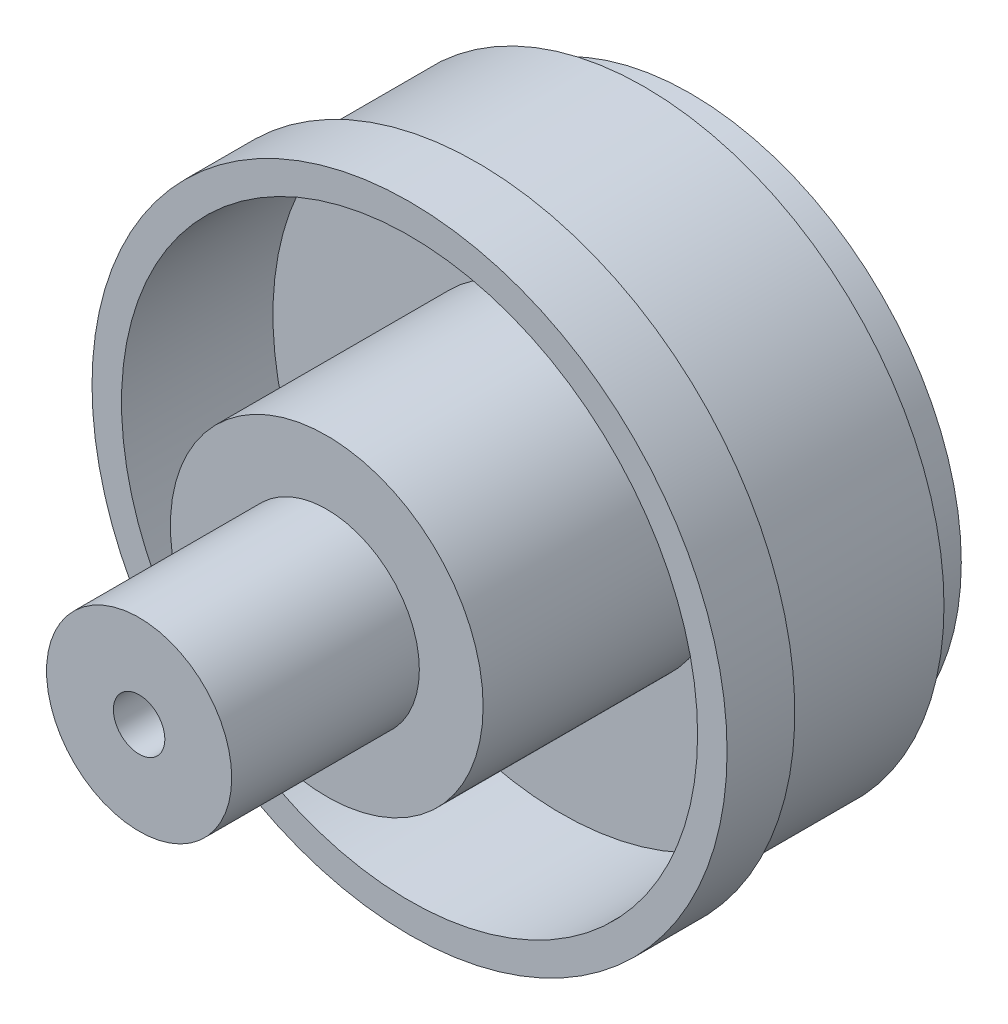
ISO-10303-21;
HEADER;
FILE_DESCRIPTION(('STEP AP214'),'2;1');
FILE_NAME('part.step','',(''),(''),'','','');
FILE_SCHEMA(('AUTOMOTIVE_DESIGN { 1 0 10303 214 1 1 1 1 }'));
ENDSEC;
DATA;
#1=APPLICATION_CONTEXT('core data for automotive mechanical design processes');
#2=APPLICATION_PROTOCOL_DEFINITION('international standard','automotive_design',2000,#1);
#3=PRODUCT_CONTEXT('',#1,'mechanical');
#4=PRODUCT('Part','Part','',(#3));
#5=PRODUCT_RELATED_PRODUCT_CATEGORY('part','',(#4));
#6=PRODUCT_DEFINITION_FORMATION('','',#4);
#7=PRODUCT_DEFINITION_CONTEXT('part definition',#1,'design');
#8=PRODUCT_DEFINITION('design','',#6,#7);
#9=PRODUCT_DEFINITION_SHAPE('','',#8);
#10=(LENGTH_UNIT() NAMED_UNIT(*) SI_UNIT(.MILLI.,.METRE.));
#11=(NAMED_UNIT(*) PLANE_ANGLE_UNIT() SI_UNIT($,.RADIAN.));
#12=(NAMED_UNIT(*) SI_UNIT($,.STERADIAN.) SOLID_ANGLE_UNIT());
#13=UNCERTAINTY_MEASURE_WITH_UNIT(LENGTH_MEASURE(1.E-05),#10,'distance_accuracy_value','');
#14=(GEOMETRIC_REPRESENTATION_CONTEXT(3) GLOBAL_UNCERTAINTY_ASSIGNED_CONTEXT((#13)) GLOBAL_UNIT_ASSIGNED_CONTEXT((#10,
#11,#12)) REPRESENTATION_CONTEXT('',''));
#15=CARTESIAN_POINT('',(0.,0.,0.));
#16=DIRECTION('',(0.,0.,1.));
#17=DIRECTION('',(1.,0.,0.));
#18=AXIS2_PLACEMENT_3D('',#15,#16,#17);
#19=CARTESIAN_POINT('',(0.,0.,32.9057));
#20=DIRECTION('',(0.,0.,-1.));
#21=DIRECTION('',(-1.,0.,0.));
#22=AXIS2_PLACEMENT_3D('',#19,#20,#21);
#23=CYLINDRICAL_SURFACE('',#22,46.228);
#24=CARTESIAN_POINT('',(0.,0.,32.9057));
#25=DIRECTION('',(0.,0.,-1.));
#26=DIRECTION('',(-1.,0.,0.));
#27=AXIS2_PLACEMENT_3D('',#24,#25,#26);
#28=CIRCLE('',#27,46.228);
#29=CARTESIAN_POINT('',(-46.228,0.,32.9057));
#30=VERTEX_POINT('',#29);
#31=EDGE_CURVE('E63',#30,#30,#28,.T.);
#32=ORIENTED_EDGE('',*,*,#31,.T.);
#33=EDGE_LOOP('',(#32));
#34=FACE_BOUND('',#33,.T.);
#35=CARTESIAN_POINT('',(0.,0.,7.112));
#36=DIRECTION('',(0.,0.,-1.));
#37=DIRECTION('',(-1.,0.,0.));
#38=AXIS2_PLACEMENT_3D('',#35,#36,#37);
#39=CIRCLE('',#38,46.228);
#40=CARTESIAN_POINT('',(-46.228,0.,7.112));
#41=VERTEX_POINT('',#40);
#42=EDGE_CURVE('E43',#41,#41,#39,.F.);
#43=ORIENTED_EDGE('',*,*,#42,.T.);
#44=EDGE_LOOP('',(#43));
#45=FACE_BOUND('',#44,.T.);
#46=ADVANCED_FACE('F39',(#34,#45),#23,.T.);
#47=CARTESIAN_POINT('',(0.,0.,56.134));
#48=DIRECTION('',(0.,0.,1.));
#49=DIRECTION('',(1.,0.,0.));
#50=AXIS2_PLACEMENT_3D('',#47,#48,#49);
#51=PLANE('',#50);
#52=CARTESIAN_POINT('',(0.,0.,56.134));
#53=DIRECTION('',(0.,0.,1.));
#54=DIRECTION('',(1.,0.,0.));
#55=AXIS2_PLACEMENT_3D('',#52,#53,#54);
#56=CIRCLE('',#55,14.2875);
#57=CARTESIAN_POINT('',(14.2875,0.,56.134));
#58=VERTEX_POINT('',#57);
#59=EDGE_CURVE('E52',#58,#58,#56,.T.);
#60=ORIENTED_EDGE('',*,*,#59,.F.);
#61=EDGE_LOOP('',(#60));
#62=FACE_BOUND('',#61,.T.);
#63=CARTESIAN_POINT('',(0.,0.,56.134));
#64=DIRECTION('',(0.,0.,1.));
#65=DIRECTION('',(1.,0.,0.));
#66=AXIS2_PLACEMENT_3D('',#63,#64,#65);
#67=CIRCLE('',#66,24.13);
#68=CARTESIAN_POINT('',(24.13,0.,56.134));
#69=VERTEX_POINT('',#68);
#70=EDGE_CURVE('E60',#69,#69,#67,.T.);
#71=ORIENTED_EDGE('',*,*,#70,.T.);
#72=EDGE_LOOP('',(#71));
#73=FACE_BOUND('',#72,.T.);
#74=ADVANCED_FACE('F102',(#62,#73),#51,.T.);
#75=CARTESIAN_POINT('',(0.,0.,85.09));
#76=DIRECTION('',(0.,0.,1.));
#77=DIRECTION('',(1.,0.,0.));
#78=AXIS2_PLACEMENT_3D('',#75,#76,#77);
#79=PLANE('',#78);
#80=CARTESIAN_POINT('',(0.,0.,85.09));
#81=DIRECTION('',(0.,0.,1.));
#82=DIRECTION('',(1.,0.,0.));
#83=AXIS2_PLACEMENT_3D('',#80,#81,#82);
#84=CIRCLE('',#83,3.96875);
#85=CARTESIAN_POINT('',(3.96875,0.,85.09));
#86=VERTEX_POINT('',#85);
#87=EDGE_CURVE('E47',#86,#86,#84,.T.);
#88=ORIENTED_EDGE('',*,*,#87,.F.);
#89=EDGE_LOOP('',(#88));
#90=FACE_BOUND('',#89,.T.);
#91=CARTESIAN_POINT('',(0.,0.,85.09));
#92=DIRECTION('',(0.,0.,1.));
#93=DIRECTION('',(1.,0.,0.));
#94=AXIS2_PLACEMENT_3D('',#91,#92,#93);
#95=CIRCLE('',#94,14.2875);
#96=CARTESIAN_POINT('',(14.2875,0.,85.09));
#97=VERTEX_POINT('',#96);
#98=EDGE_CURVE('E55',#97,#97,#95,.T.);
#99=ORIENTED_EDGE('',*,*,#98,.T.);
#100=EDGE_LOOP('',(#99));
#101=FACE_BOUND('',#100,.T.);
#102=ADVANCED_FACE('F83',(#90,#101),#79,.T.);
#103=CARTESIAN_POINT('',(0.,0.,58.42));
#104=DIRECTION('',(0.,0.,1.));
#105=DIRECTION('',(1.,0.,0.));
#106=AXIS2_PLACEMENT_3D('',#103,#104,#105);
#107=CYLINDRICAL_SURFACE('',#106,3.96875);
#108=CARTESIAN_POINT('',(0.,0.,58.42));
#109=DIRECTION('',(0.,0.,1.));
#110=DIRECTION('',(1.,0.,0.));
#111=AXIS2_PLACEMENT_3D('',#108,#109,#110);
#112=CIRCLE('',#111,3.96875);
#113=CARTESIAN_POINT('',(3.96875,0.,58.42));
#114=VERTEX_POINT('',#113);
#115=EDGE_CURVE('E11',#114,#114,#112,.T.);
#116=ORIENTED_EDGE('',*,*,#115,.F.);
#117=EDGE_LOOP('',(#116));
#118=FACE_BOUND('',#117,.T.);
#119=ORIENTED_EDGE('',*,*,#87,.T.);
#120=EDGE_LOOP('',(#119));
#121=FACE_BOUND('',#120,.T.);
#122=ADVANCED_FACE('F97',(#118,#121),#107,.F.);
#123=CARTESIAN_POINT('',(0.,0.,58.42));
#124=DIRECTION('',(0.,0.,1.));
#125=DIRECTION('',(1.,0.,0.));
#126=AXIS2_PLACEMENT_3D('',#123,#124,#125);
#127=PLANE('',#126);
#128=ORIENTED_EDGE('',*,*,#115,.T.);
#129=EDGE_LOOP('',(#128));
#130=FACE_BOUND('',#129,.T.);
#131=ADVANCED_FACE('F88',(#130),#127,.T.);
#132=CARTESIAN_POINT('',(0.,0.,56.134));
#133=DIRECTION('',(0.,0.,1.));
#134=DIRECTION('',(1.,0.,0.));
#135=AXIS2_PLACEMENT_3D('',#132,#133,#134);
#136=CYLINDRICAL_SURFACE('',#135,14.2875);
#137=ORIENTED_EDGE('',*,*,#59,.T.);
#138=EDGE_LOOP('',(#137));
#139=FACE_BOUND('',#138,.T.);
#140=ORIENTED_EDGE('',*,*,#98,.F.);
#141=EDGE_LOOP('',(#140));
#142=FACE_BOUND('',#141,.T.);
#143=ADVANCED_FACE('F85',(#139,#142),#136,.T.);
#144=CARTESIAN_POINT('',(0.,0.,43.3578));
#145=DIRECTION('',(0.,0.,1.));
#146=DIRECTION('',(1.,0.,0.));
#147=AXIS2_PLACEMENT_3D('',#144,#145,#146);
#148=CYLINDRICAL_SURFACE('',#147,24.13);
#149=ORIENTED_EDGE('',*,*,#70,.F.);
#150=EDGE_LOOP('',(#149));
#151=FACE_BOUND('',#150,.T.);
#152=CARTESIAN_POINT('',(0.,0.,19.9898));
#153=DIRECTION('',(0.,0.,1.));
#154=DIRECTION('',(1.,0.,0.));
#155=AXIS2_PLACEMENT_3D('',#152,#153,#154);
#156=CIRCLE('',#155,24.13);
#157=CARTESIAN_POINT('',(24.13,0.,19.9898));
#158=VERTEX_POINT('',#157);
#159=EDGE_CURVE('E134',#158,#158,#156,.T.);
#160=ORIENTED_EDGE('',*,*,#159,.T.);
#161=EDGE_LOOP('',(#160));
#162=FACE_BOUND('',#161,.T.);
#163=ADVANCED_FACE('F87',(#151,#162),#148,.T.);
#164=CARTESIAN_POINT('',(0.,0.,19.9898));
#165=DIRECTION('',(0.,0.,1.));
#166=DIRECTION('',(1.,0.,0.));
#167=AXIS2_PLACEMENT_3D('',#164,#165,#166);
#168=CYLINDRICAL_SURFACE('',#167,44.45);
#169=CARTESIAN_POINT('',(0.,0.,19.9898));
#170=DIRECTION('',(0.,0.,1.));
#171=DIRECTION('',(1.,0.,0.));
#172=AXIS2_PLACEMENT_3D('',#169,#170,#171);
#173=CIRCLE('',#172,44.45);
#174=CARTESIAN_POINT('',(44.45,0.,19.9898));
#175=VERTEX_POINT('',#174);
#176=EDGE_CURVE('E69',#175,#175,#173,.T.);
#177=ORIENTED_EDGE('',*,*,#176,.F.);
#178=EDGE_LOOP('',(#177));
#179=FACE_BOUND('',#178,.T.);
#180=CARTESIAN_POINT('',(0.,0.,43.3578));
#181=DIRECTION('',(0.,0.,1.));
#182=DIRECTION('',(1.,0.,0.));
#183=AXIS2_PLACEMENT_3D('',#180,#181,#182);
#184=CIRCLE('',#183,44.45);
#185=CARTESIAN_POINT('',(44.45,0.,43.3578));
#186=VERTEX_POINT('',#185);
#187=EDGE_CURVE('E74',#186,#186,#184,.T.);
#188=ORIENTED_EDGE('',*,*,#187,.T.);
#189=EDGE_LOOP('',(#188));
#190=FACE_BOUND('',#189,.T.);
#191=ADVANCED_FACE('F94',(#179,#190),#168,.F.);
#192=CARTESIAN_POINT('',(0.,0.,19.9898));
#193=DIRECTION('',(0.,0.,1.));
#194=DIRECTION('',(1.,0.,0.));
#195=AXIS2_PLACEMENT_3D('',#192,#193,#194);
#196=PLANE('',#195);
#197=ORIENTED_EDGE('',*,*,#159,.F.);
#198=EDGE_LOOP('',(#197));
#199=FACE_BOUND('',#198,.T.);
#200=ORIENTED_EDGE('',*,*,#176,.T.);
#201=EDGE_LOOP('',(#200));
#202=FACE_BOUND('',#201,.T.);
#203=ADVANCED_FACE('F114',(#199,#202),#196,.T.);
#204=CARTESIAN_POINT('',(0.,0.,32.9057));
#205=DIRECTION('',(0.,0.,-1.));
#206=DIRECTION('',(-1.,0.,0.));
#207=AXIS2_PLACEMENT_3D('',#204,#205,#206);
#208=PLANE('',#207);
#209=ORIENTED_EDGE('',*,*,#31,.F.);
#210=EDGE_LOOP('',(#209));
#211=FACE_BOUND('',#210,.T.);
#212=CARTESIAN_POINT('',(0.,0.,32.9057));
#213=DIRECTION('',(0.,0.,-1.));
#214=DIRECTION('',(-1.,0.,0.));
#215=AXIS2_PLACEMENT_3D('',#212,#213,#214);
#216=CIRCLE('',#215,49.);
#217=CARTESIAN_POINT('',(-49.,0.,32.9057));
#218=VERTEX_POINT('',#217);
#219=EDGE_CURVE('E61',#218,#218,#216,.T.);
#220=ORIENTED_EDGE('',*,*,#219,.T.);
#221=EDGE_LOOP('',(#220));
#222=FACE_BOUND('',#221,.T.);
#223=ADVANCED_FACE('F112',(#211,#222),#208,.T.);
#224=CARTESIAN_POINT('',(0.,0.,85.09));
#225=DIRECTION('',(0.,0.,-1.));
#226=DIRECTION('',(-1.,0.,0.));
#227=AXIS2_PLACEMENT_3D('',#224,#225,#226);
#228=CYLINDRICAL_SURFACE('',#227,49.);
#229=CARTESIAN_POINT('',(0.,0.,43.3578));
#230=DIRECTION('',(0.,0.,1.));
#231=DIRECTION('',(1.,0.,0.));
#232=AXIS2_PLACEMENT_3D('',#229,#230,#231);
#233=CIRCLE('',#232,49.);
#234=CARTESIAN_POINT('',(49.,0.,43.3578));
#235=VERTEX_POINT('',#234);
#236=EDGE_CURVE('E58',#235,#235,#233,.T.);
#237=ORIENTED_EDGE('',*,*,#236,.F.);
#238=EDGE_LOOP('',(#237));
#239=FACE_BOUND('',#238,.T.);
#240=ORIENTED_EDGE('',*,*,#219,.F.);
#241=EDGE_LOOP('',(#240));
#242=FACE_BOUND('',#241,.T.);
#243=ADVANCED_FACE('F41',(#239,#242),#228,.T.);
#244=CARTESIAN_POINT('',(0.,0.,43.3578));
#245=DIRECTION('',(0.,0.,1.));
#246=DIRECTION('',(1.,0.,0.));
#247=AXIS2_PLACEMENT_3D('',#244,#245,#246);
#248=PLANE('',#247);
#249=ORIENTED_EDGE('',*,*,#187,.F.);
#250=EDGE_LOOP('',(#249));
#251=FACE_BOUND('',#250,.T.);
#252=ORIENTED_EDGE('',*,*,#236,.T.);
#253=EDGE_LOOP('',(#252));
#254=FACE_BOUND('',#253,.T.);
#255=ADVANCED_FACE('F116',(#251,#254),#248,.T.);
#256=CARTESIAN_POINT('',(0.,0.,7.112));
#257=DIRECTION('',(0.,0.,-1.));
#258=DIRECTION('',(-1.,0.,0.));
#259=AXIS2_PLACEMENT_3D('',#256,#257,#258);
#260=PLANE('',#259);
#261=ORIENTED_EDGE('',*,*,#42,.F.);
#262=EDGE_LOOP('',(#261));
#263=FACE_BOUND('',#262,.T.);
#264=CARTESIAN_POINT('',(0.,0.,7.112));
#265=DIRECTION('',(0.,0.,-1.));
#266=DIRECTION('',(-1.,0.,0.));
#267=AXIS2_PLACEMENT_3D('',#264,#265,#266);
#268=CIRCLE('',#267,41.783);
#269=CARTESIAN_POINT('',(-41.783,0.,7.112));
#270=VERTEX_POINT('',#269);
#271=EDGE_CURVE('E149',#270,#270,#268,.T.);
#272=ORIENTED_EDGE('',*,*,#271,.F.);
#273=EDGE_LOOP('',(#272));
#274=FACE_BOUND('',#273,.T.);
#275=ADVANCED_FACE('F118',(#263,#274),#260,.T.);
#276=CARTESIAN_POINT('',(0.,0.,7.112));
#277=DIRECTION('',(0.,0.,-1.));
#278=DIRECTION('',(-1.,0.,0.));
#279=AXIS2_PLACEMENT_3D('',#276,#277,#278);
#280=CYLINDRICAL_SURFACE('',#279,41.783);
#281=ORIENTED_EDGE('',*,*,#271,.T.);
#282=EDGE_LOOP('',(#281));
#283=FACE_BOUND('',#282,.T.);
#284=CARTESIAN_POINT('',(0.,0.,0.));
#285=DIRECTION('',(0.,0.,-1.));
#286=DIRECTION('',(-1.,0.,0.));
#287=AXIS2_PLACEMENT_3D('',#284,#285,#286);
#288=CIRCLE('',#287,41.783);
#289=CARTESIAN_POINT('',(-41.783,0.,0.));
#290=VERTEX_POINT('',#289);
#291=EDGE_CURVE('E146',#290,#290,#288,.T.);
#292=ORIENTED_EDGE('',*,*,#291,.F.);
#293=EDGE_LOOP('',(#292));
#294=FACE_BOUND('',#293,.T.);
#295=ADVANCED_FACE('F124',(#283,#294),#280,.T.);
#296=CARTESIAN_POINT('',(0.,0.,50.8));
#297=DIRECTION('',(0.,0.,-1.));
#298=DIRECTION('',(-1.,0.,0.));
#299=AXIS2_PLACEMENT_3D('',#296,#297,#298);
#300=PLANE('',#299);
#301=CARTESIAN_POINT('',(0.,0.,50.8));
#302=DIRECTION('',(0.,0.,-1.));
#303=DIRECTION('',(-1.,0.,0.));
#304=AXIS2_PLACEMENT_3D('',#301,#302,#303);
#305=CIRCLE('',#304,19.05);
#306=CARTESIAN_POINT('',(-19.05,0.,50.8));
#307=VERTEX_POINT('',#306);
#308=EDGE_CURVE('E136',#307,#307,#305,.T.);
#309=ORIENTED_EDGE('',*,*,#308,.T.);
#310=EDGE_LOOP('',(#309));
#311=FACE_BOUND('',#310,.T.);
#312=ADVANCED_FACE('F158',(#311),#300,.T.);
#313=CARTESIAN_POINT('',(0.,0.,50.8));
#314=DIRECTION('',(0.,0.,-1.));
#315=DIRECTION('',(-1.,0.,0.));
#316=AXIS2_PLACEMENT_3D('',#313,#314,#315);
#317=CYLINDRICAL_SURFACE('',#316,19.05);
#318=ORIENTED_EDGE('',*,*,#308,.F.);
#319=EDGE_LOOP('',(#318));
#320=FACE_BOUND('',#319,.T.);
#321=CARTESIAN_POINT('',(0.,0.,0.));
#322=DIRECTION('',(0.,0.,-1.));
#323=DIRECTION('',(-1.,0.,0.));
#324=AXIS2_PLACEMENT_3D('',#321,#322,#323);
#325=CIRCLE('',#324,19.05);
#326=CARTESIAN_POINT('',(-19.05,0.,0.));
#327=VERTEX_POINT('',#326);
#328=EDGE_CURVE('E141',#327,#327,#325,.T.);
#329=ORIENTED_EDGE('',*,*,#328,.T.);
#330=EDGE_LOOP('',(#329));
#331=FACE_BOUND('',#330,.T.);
#332=ADVANCED_FACE('F164',(#320,#331),#317,.F.);
#333=CARTESIAN_POINT('',(0.,0.,0.));
#334=DIRECTION('',(0.,0.,1.));
#335=DIRECTION('',(1.,0.,0.));
#336=AXIS2_PLACEMENT_3D('',#333,#334,#335);
#337=PLANE('',#336);
#338=ORIENTED_EDGE('',*,*,#328,.F.);
#339=EDGE_LOOP('',(#338));
#340=FACE_BOUND('',#339,.T.);
#341=ORIENTED_EDGE('',*,*,#291,.T.);
#342=EDGE_LOOP('',(#341));
#343=FACE_BOUND('',#342,.T.);
#344=ADVANCED_FACE('F162',(#340,#343),#337,.F.);
#345=CLOSED_SHELL('',(#46,#74,#102,#122,#131,#143,#163,#191,#203,#223,#243,#255,#275,#295,#312,
#332,#344));
#346=MANIFOLD_SOLID_BREP('B2',#345);
#347=ADVANCED_BREP_SHAPE_REPRESENTATION('',(#18,#346),#14);
#348=SHAPE_DEFINITION_REPRESENTATION(#9,#347);
ENDSEC;
END-ISO-10303-21;
